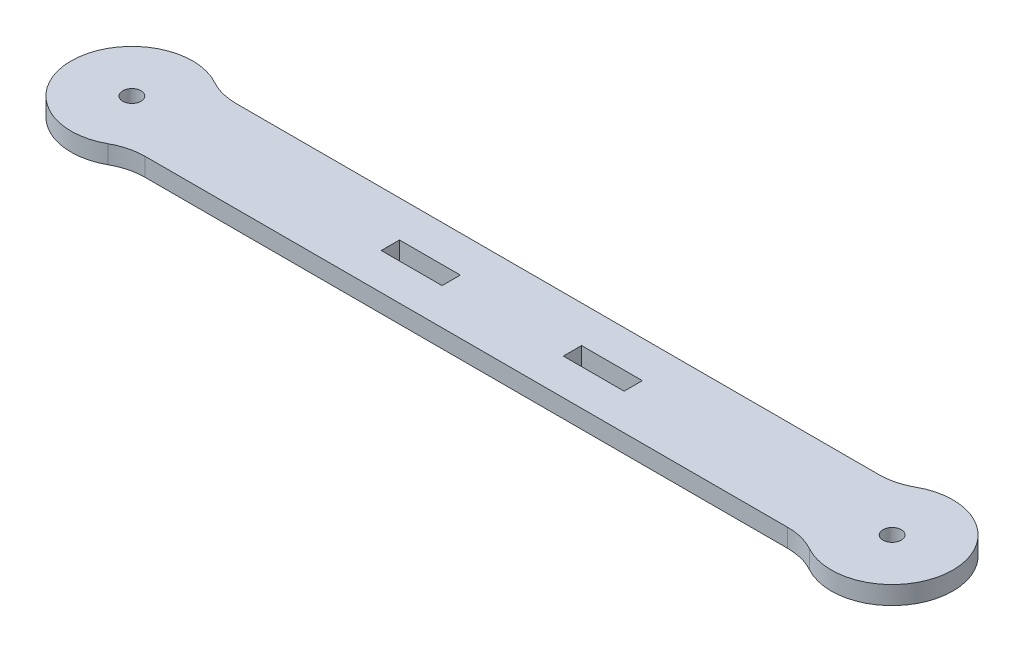
ISO-10303-21;
HEADER;
FILE_DESCRIPTION(('STEP AP214'),'2;1');
FILE_NAME('part.step','',(''),(''),'','','');
FILE_SCHEMA(('AUTOMOTIVE_DESIGN { 1 0 10303 214 1 1 1 1 }'));
ENDSEC;
DATA;
#1=APPLICATION_CONTEXT('core data for automotive mechanical design processes');
#2=APPLICATION_PROTOCOL_DEFINITION('international standard','automotive_design',2000,#1);
#3=PRODUCT_CONTEXT('',#1,'mechanical');
#4=PRODUCT('Part','Part','',(#3));
#5=PRODUCT_RELATED_PRODUCT_CATEGORY('part','',(#4));
#6=PRODUCT_DEFINITION_FORMATION('','',#4);
#7=PRODUCT_DEFINITION_CONTEXT('part definition',#1,'design');
#8=PRODUCT_DEFINITION('design','',#6,#7);
#9=PRODUCT_DEFINITION_SHAPE('','',#8);
#10=(LENGTH_UNIT() NAMED_UNIT(*) SI_UNIT(.MILLI.,.METRE.));
#11=(NAMED_UNIT(*) PLANE_ANGLE_UNIT() SI_UNIT($,.RADIAN.));
#12=(NAMED_UNIT(*) SI_UNIT($,.STERADIAN.) SOLID_ANGLE_UNIT());
#13=UNCERTAINTY_MEASURE_WITH_UNIT(LENGTH_MEASURE(1.E-05),#10,'distance_accuracy_value','');
#14=(GEOMETRIC_REPRESENTATION_CONTEXT(3) GLOBAL_UNCERTAINTY_ASSIGNED_CONTEXT((#13)) GLOBAL_UNIT_ASSIGNED_CONTEXT((#10,
#11,#12)) REPRESENTATION_CONTEXT('',''));
#15=CARTESIAN_POINT('',(0.,0.,0.));
#16=DIRECTION('',(0.,0.,1.));
#17=DIRECTION('',(1.,0.,0.));
#18=AXIS2_PLACEMENT_3D('',#15,#16,#17);
#19=CARTESIAN_POINT('',(-62.5,3.,0.));
#20=DIRECTION('',(0.,1.,0.));
#21=DIRECTION('',(0.,0.,1.));
#22=AXIS2_PLACEMENT_3D('',#19,#20,#21);
#23=PLANE('',#22);
#24=CARTESIAN_POINT('',(-62.5,3.,0.));
#25=DIRECTION('',(0.,1.,0.));
#26=DIRECTION('',(0.,0.,1.));
#27=AXIS2_PLACEMENT_3D('',#24,#25,#26);
#28=CIRCLE('',#27,1.5);
#29=CARTESIAN_POINT('',(-62.5,3.,1.5));
#30=VERTEX_POINT('',#29);
#31=EDGE_CURVE('E259',#30,#30,#28,.T.);
#32=ORIENTED_EDGE('',*,*,#31,.F.);
#33=EDGE_LOOP('',(#32));
#34=FACE_BOUND('',#33,.T.);
#35=DIRECTION('',(-1.,0.,0.));
#36=VECTOR('',#35,1.);
#37=CARTESIAN_POINT('',(-55.8856217223385,3.,-7.5));
#38=LINE('',#37,#36);
#39=CARTESIAN_POINT('',(52.8175416344814,3.,-7.50000000000001));
#40=VERTEX_POINT('',#39);
#41=CARTESIAN_POINT('',(-52.8175416344815,3.,-7.5));
#42=VERTEX_POINT('',#41);
#43=EDGE_CURVE('E279',#40,#42,#38,.T.);
#44=ORIENTED_EDGE('',*,*,#43,.T.);
#45=CARTESIAN_POINT('',(-52.8175416344815,3.,-17.5));
#46=DIRECTION('',(0.,1.,0.));
#47=DIRECTION('',(0.,0.,1.));
#48=AXIS2_PLACEMENT_3D('',#45,#46,#47);
#49=CIRCLE('',#48,10.);
#50=CARTESIAN_POINT('',(-57.6587708172407,3.,-8.75));
#51=VERTEX_POINT('',#50);
#52=EDGE_CURVE('E11',#42,#51,#49,.F.);
#53=ORIENTED_EDGE('',*,*,#52,.T.);
#54=CARTESIAN_POINT('',(-62.5,3.,0.));
#55=DIRECTION('',(0.,1.,0.));
#56=DIRECTION('',(0.,0.,1.));
#57=AXIS2_PLACEMENT_3D('',#54,#55,#56);
#58=CIRCLE('',#57,10.);
#59=CARTESIAN_POINT('',(-57.6587708172407,3.,8.75));
#60=VERTEX_POINT('',#59);
#61=EDGE_CURVE('E267',#51,#60,#58,.T.);
#62=ORIENTED_EDGE('',*,*,#61,.T.);
#63=CARTESIAN_POINT('',(-52.8175416344815,3.,17.5));
#64=DIRECTION('',(0.,1.,0.));
#65=DIRECTION('',(0.,0.,1.));
#66=AXIS2_PLACEMENT_3D('',#63,#64,#65);
#67=CIRCLE('',#66,10.);
#68=CARTESIAN_POINT('',(-52.8175416344815,3.,7.5));
#69=VERTEX_POINT('',#68);
#70=EDGE_CURVE('E331',#60,#69,#67,.F.);
#71=ORIENTED_EDGE('',*,*,#70,.T.);
#72=DIRECTION('',(1.,0.,0.));
#73=VECTOR('',#72,1.);
#74=CARTESIAN_POINT('',(-55.8856217223385,3.,7.5));
#75=LINE('',#74,#73);
#76=CARTESIAN_POINT('',(52.8175416344814,3.,7.49999999999999));
#77=VERTEX_POINT('',#76);
#78=EDGE_CURVE('E271',#69,#77,#75,.T.);
#79=ORIENTED_EDGE('',*,*,#78,.T.);
#80=CARTESIAN_POINT('',(52.8175416344814,3.,17.5));
#81=DIRECTION('',(0.,1.,0.));
#82=DIRECTION('',(0.,0.,1.));
#83=AXIS2_PLACEMENT_3D('',#80,#81,#82);
#84=CIRCLE('',#83,10.);
#85=CARTESIAN_POINT('',(57.6587708172407,3.,8.74999999999998));
#86=VERTEX_POINT('',#85);
#87=EDGE_CURVE('E325',#77,#86,#84,.F.);
#88=ORIENTED_EDGE('',*,*,#87,.T.);
#89=CARTESIAN_POINT('',(62.5,3.,0.));
#90=DIRECTION('',(0.,1.,0.));
#91=DIRECTION('',(0.,0.,1.));
#92=AXIS2_PLACEMENT_3D('',#89,#90,#91);
#93=CIRCLE('',#92,10.);
#94=CARTESIAN_POINT('',(57.6587708172407,3.,-8.75000000000001));
#95=VERTEX_POINT('',#94);
#96=EDGE_CURVE('E276',#86,#95,#93,.T.);
#97=ORIENTED_EDGE('',*,*,#96,.T.);
#98=CARTESIAN_POINT('',(52.8175416344814,3.,-17.5));
#99=DIRECTION('',(0.,1.,0.));
#100=DIRECTION('',(0.,0.,1.));
#101=AXIS2_PLACEMENT_3D('',#98,#99,#100);
#102=CIRCLE('',#101,10.);
#103=EDGE_CURVE('E62',#95,#40,#102,.F.);
#104=ORIENTED_EDGE('',*,*,#103,.T.);
#105=EDGE_LOOP('',(#44,#53,#62,#71,#79,#88,#97,#104));
#106=FACE_BOUND('',#105,.T.);
#107=CARTESIAN_POINT('',(62.5,3.,0.));
#108=DIRECTION('',(0.,1.,0.));
#109=DIRECTION('',(0.,0.,1.));
#110=AXIS2_PLACEMENT_3D('',#107,#108,#109);
#111=CIRCLE('',#110,1.5);
#112=CARTESIAN_POINT('',(62.5,3.,1.49999999999998));
#113=VERTEX_POINT('',#112);
#114=EDGE_CURVE('E251',#113,#113,#111,.T.);
#115=ORIENTED_EDGE('',*,*,#114,.F.);
#116=EDGE_LOOP('',(#115));
#117=FACE_BOUND('',#116,.T.);
#118=DIRECTION('',(1.,0.,0.));
#119=VECTOR('',#118,1.);
#120=CARTESIAN_POINT('',(-20.,3.,1.5));
#121=LINE('',#120,#119);
#122=CARTESIAN_POINT('',(-20.,3.,1.5));
#123=VERTEX_POINT('',#122);
#124=CARTESIAN_POINT('',(-10.,3.,1.50000000000002));
#125=VERTEX_POINT('',#124);
#126=EDGE_CURVE('E211',#123,#125,#121,.T.);
#127=ORIENTED_EDGE('',*,*,#126,.F.);
#128=DIRECTION('',(0.,0.,1.));
#129=VECTOR('',#128,1.);
#130=CARTESIAN_POINT('',(-20.,3.,-1.5));
#131=LINE('',#130,#129);
#132=CARTESIAN_POINT('',(-20.,3.,-1.5));
#133=VERTEX_POINT('',#132);
#134=EDGE_CURVE('E208',#133,#123,#131,.T.);
#135=ORIENTED_EDGE('',*,*,#134,.F.);
#136=DIRECTION('',(-1.,0.,0.));
#137=VECTOR('',#136,1.);
#138=CARTESIAN_POINT('',(-20.,3.,-1.5));
#139=LINE('',#138,#137);
#140=CARTESIAN_POINT('',(-10.,3.,-1.5));
#141=VERTEX_POINT('',#140);
#142=EDGE_CURVE('E219',#141,#133,#139,.T.);
#143=ORIENTED_EDGE('',*,*,#142,.F.);
#144=DIRECTION('',(0.,0.,-1.));
#145=VECTOR('',#144,1.);
#146=CARTESIAN_POINT('',(-10.,3.,-1.5));
#147=LINE('',#146,#145);
#148=EDGE_CURVE('E215',#125,#141,#147,.T.);
#149=ORIENTED_EDGE('',*,*,#148,.F.);
#150=EDGE_LOOP('',(#127,#135,#143,#149));
#151=FACE_BOUND('',#150,.T.);
#152=DIRECTION('',(1.,0.,0.));
#153=VECTOR('',#152,1.);
#154=CARTESIAN_POINT('',(9.99999999999999,3.,1.56405872582707));
#155=LINE('',#154,#153);
#156=CARTESIAN_POINT('',(9.99999999999999,3.,1.56405872582707));
#157=VERTEX_POINT('',#156);
#158=CARTESIAN_POINT('',(20.,3.,1.56405872582707));
#159=VERTEX_POINT('',#158);
#160=EDGE_CURVE('E166',#157,#159,#155,.T.);
#161=ORIENTED_EDGE('',*,*,#160,.F.);
#162=DIRECTION('',(0.,0.,1.));
#163=VECTOR('',#162,1.);
#164=CARTESIAN_POINT('',(10.,3.,-1.43594127417295));
#165=LINE('',#164,#163);
#166=CARTESIAN_POINT('',(10.,3.,-1.43594127417295));
#167=VERTEX_POINT('',#166);
#168=EDGE_CURVE('E155',#167,#157,#165,.T.);
#169=ORIENTED_EDGE('',*,*,#168,.F.);
#170=DIRECTION('',(-1.,0.,0.));
#171=VECTOR('',#170,1.);
#172=CARTESIAN_POINT('',(10.,3.,-1.43594127417295));
#173=LINE('',#172,#171);
#174=CARTESIAN_POINT('',(20.,3.,-1.43594127417295));
#175=VERTEX_POINT('',#174);
#176=EDGE_CURVE('E184',#175,#167,#173,.T.);
#177=ORIENTED_EDGE('',*,*,#176,.F.);
#178=DIRECTION('',(0.,0.,-1.));
#179=VECTOR('',#178,1.);
#180=CARTESIAN_POINT('',(20.,3.,-1.43594127417295));
#181=LINE('',#180,#179);
#182=EDGE_CURVE('E180',#159,#175,#181,.T.);
#183=ORIENTED_EDGE('',*,*,#182,.F.);
#184=EDGE_LOOP('',(#161,#169,#177,#183));
#185=FACE_BOUND('',#184,.T.);
#186=ADVANCED_FACE('F39',(#34,#106,#117,#151,#185),#23,.T.);
#187=CARTESIAN_POINT('',(-62.5,0.,0.));
#188=DIRECTION('',(0.,1.,0.));
#189=DIRECTION('',(0.,0.,1.));
#190=AXIS2_PLACEMENT_3D('',#187,#188,#189);
#191=PLANE('',#190);
#192=DIRECTION('',(0.,0.,1.));
#193=VECTOR('',#192,1.);
#194=CARTESIAN_POINT('',(-20.,0.,-1.5));
#195=LINE('',#194,#193);
#196=CARTESIAN_POINT('',(-20.,0.,-1.5));
#197=VERTEX_POINT('',#196);
#198=CARTESIAN_POINT('',(-20.,0.,1.5));
#199=VERTEX_POINT('',#198);
#200=EDGE_CURVE('E175',#197,#199,#195,.T.);
#201=ORIENTED_EDGE('',*,*,#200,.T.);
#202=DIRECTION('',(1.,0.,0.));
#203=VECTOR('',#202,1.);
#204=CARTESIAN_POINT('',(-20.,0.,1.5));
#205=LINE('',#204,#203);
#206=CARTESIAN_POINT('',(-10.,0.,1.50000000000002));
#207=VERTEX_POINT('',#206);
#208=EDGE_CURVE('E226',#199,#207,#205,.T.);
#209=ORIENTED_EDGE('',*,*,#208,.T.);
#210=DIRECTION('',(0.,0.,-1.));
#211=VECTOR('',#210,1.);
#212=CARTESIAN_POINT('',(-10.,0.,-1.5));
#213=LINE('',#212,#211);
#214=CARTESIAN_POINT('',(-10.,0.,-1.5));
#215=VERTEX_POINT('',#214);
#216=EDGE_CURVE('E230',#207,#215,#213,.T.);
#217=ORIENTED_EDGE('',*,*,#216,.T.);
#218=DIRECTION('',(-1.,0.,0.));
#219=VECTOR('',#218,1.);
#220=CARTESIAN_POINT('',(-20.,0.,-1.5));
#221=LINE('',#220,#219);
#222=EDGE_CURVE('E212',#215,#197,#221,.T.);
#223=ORIENTED_EDGE('',*,*,#222,.T.);
#224=EDGE_LOOP('',(#201,#209,#217,#223));
#225=FACE_BOUND('',#224,.T.);
#226=CARTESIAN_POINT('',(-62.5,0.,0.));
#227=DIRECTION('',(0.,1.,0.));
#228=DIRECTION('',(0.,0.,1.));
#229=AXIS2_PLACEMENT_3D('',#226,#227,#228);
#230=CIRCLE('',#229,10.);
#231=CARTESIAN_POINT('',(-57.6587708172407,0.,-8.75));
#232=VERTEX_POINT('',#231);
#233=CARTESIAN_POINT('',(-57.6587708172407,0.,8.75));
#234=VERTEX_POINT('',#233);
#235=EDGE_CURVE('E263',#232,#234,#230,.T.);
#236=ORIENTED_EDGE('',*,*,#235,.F.);
#237=CARTESIAN_POINT('',(-52.8175416344815,0.,-17.5));
#238=DIRECTION('',(0.,1.,0.));
#239=DIRECTION('',(0.,0.,1.));
#240=AXIS2_PLACEMENT_3D('',#237,#238,#239);
#241=CIRCLE('',#240,10.);
#242=CARTESIAN_POINT('',(-52.8175416344815,0.,-7.5));
#243=VERTEX_POINT('',#242);
#244=EDGE_CURVE('E48',#232,#243,#241,.T.);
#245=ORIENTED_EDGE('',*,*,#244,.T.);
#246=DIRECTION('',(-1.,0.,0.));
#247=VECTOR('',#246,1.);
#248=CARTESIAN_POINT('',(-55.8856217223385,0.,-7.5));
#249=LINE('',#248,#247);
#250=CARTESIAN_POINT('',(52.8175416344814,0.,-7.50000000000001));
#251=VERTEX_POINT('',#250);
#252=EDGE_CURVE('E272',#251,#243,#249,.T.);
#253=ORIENTED_EDGE('',*,*,#252,.F.);
#254=CARTESIAN_POINT('',(52.8175416344814,0.,-17.5));
#255=DIRECTION('',(0.,1.,0.));
#256=DIRECTION('',(0.,0.,1.));
#257=AXIS2_PLACEMENT_3D('',#254,#255,#256);
#258=CIRCLE('',#257,10.);
#259=CARTESIAN_POINT('',(57.6587708172407,0.,-8.75000000000001));
#260=VERTEX_POINT('',#259);
#261=EDGE_CURVE('E334',#251,#260,#258,.T.);
#262=ORIENTED_EDGE('',*,*,#261,.T.);
#263=CARTESIAN_POINT('',(62.5,0.,0.));
#264=DIRECTION('',(0.,1.,0.));
#265=DIRECTION('',(0.,0.,1.));
#266=AXIS2_PLACEMENT_3D('',#263,#264,#265);
#267=CIRCLE('',#266,10.);
#268=CARTESIAN_POINT('',(57.6587708172407,0.,8.74999999999998));
#269=VERTEX_POINT('',#268);
#270=EDGE_CURVE('E290',#269,#260,#267,.T.);
#271=ORIENTED_EDGE('',*,*,#270,.F.);
#272=CARTESIAN_POINT('',(52.8175416344814,0.,17.5));
#273=DIRECTION('',(0.,1.,0.));
#274=DIRECTION('',(0.,0.,1.));
#275=AXIS2_PLACEMENT_3D('',#272,#273,#274);
#276=CIRCLE('',#275,10.);
#277=CARTESIAN_POINT('',(52.8175416344814,0.,7.49999999999999));
#278=VERTEX_POINT('',#277);
#279=EDGE_CURVE('E322',#269,#278,#276,.T.);
#280=ORIENTED_EDGE('',*,*,#279,.T.);
#281=DIRECTION('',(1.,0.,0.));
#282=VECTOR('',#281,1.);
#283=CARTESIAN_POINT('',(-55.8856217223385,0.,7.5));
#284=LINE('',#283,#282);
#285=CARTESIAN_POINT('',(-52.8175416344815,0.,7.5));
#286=VERTEX_POINT('',#285);
#287=EDGE_CURVE('E286',#286,#278,#284,.T.);
#288=ORIENTED_EDGE('',*,*,#287,.F.);
#289=CARTESIAN_POINT('',(-52.8175416344815,0.,17.5));
#290=DIRECTION('',(0.,1.,0.));
#291=DIRECTION('',(0.,0.,1.));
#292=AXIS2_PLACEMENT_3D('',#289,#290,#291);
#293=CIRCLE('',#292,10.);
#294=EDGE_CURVE('E328',#286,#234,#293,.T.);
#295=ORIENTED_EDGE('',*,*,#294,.T.);
#296=EDGE_LOOP('',(#236,#245,#253,#262,#271,#280,#288,#295));
#297=FACE_BOUND('',#296,.T.);
#298=CARTESIAN_POINT('',(-62.5,0.,0.));
#299=DIRECTION('',(0.,1.,0.));
#300=DIRECTION('',(0.,0.,1.));
#301=AXIS2_PLACEMENT_3D('',#298,#299,#300);
#302=CIRCLE('',#301,1.5);
#303=CARTESIAN_POINT('',(-62.5,0.,1.5));
#304=VERTEX_POINT('',#303);
#305=EDGE_CURVE('E255',#304,#304,#302,.T.);
#306=ORIENTED_EDGE('',*,*,#305,.T.);
#307=EDGE_LOOP('',(#306));
#308=FACE_BOUND('',#307,.T.);
#309=CARTESIAN_POINT('',(62.5,0.,0.));
#310=DIRECTION('',(0.,1.,0.));
#311=DIRECTION('',(0.,0.,1.));
#312=AXIS2_PLACEMENT_3D('',#309,#310,#311);
#313=CIRCLE('',#312,1.5);
#314=CARTESIAN_POINT('',(62.5,0.,1.49999999999998));
#315=VERTEX_POINT('',#314);
#316=EDGE_CURVE('E250',#315,#315,#313,.T.);
#317=ORIENTED_EDGE('',*,*,#316,.T.);
#318=EDGE_LOOP('',(#317));
#319=FACE_BOUND('',#318,.T.);
#320=DIRECTION('',(0.,0.,1.));
#321=VECTOR('',#320,1.);
#322=CARTESIAN_POINT('',(10.,0.,-1.43594127417295));
#323=LINE('',#322,#321);
#324=CARTESIAN_POINT('',(9.99999999999999,0.,-1.43594127417295));
#325=VERTEX_POINT('',#324);
#326=CARTESIAN_POINT('',(9.99999999999999,0.,1.56405872582707));
#327=VERTEX_POINT('',#326);
#328=EDGE_CURVE('E189',#325,#327,#323,.T.);
#329=ORIENTED_EDGE('',*,*,#328,.T.);
#330=DIRECTION('',(1.,0.,0.));
#331=VECTOR('',#330,1.);
#332=CARTESIAN_POINT('',(9.99999999999999,0.,1.56405872582707));
#333=LINE('',#332,#331);
#334=CARTESIAN_POINT('',(20.,0.,1.56405872582707));
#335=VERTEX_POINT('',#334);
#336=EDGE_CURVE('E173',#327,#335,#333,.T.);
#337=ORIENTED_EDGE('',*,*,#336,.T.);
#338=DIRECTION('',(0.,0.,-1.));
#339=VECTOR('',#338,1.);
#340=CARTESIAN_POINT('',(20.,0.,-1.43594127417295));
#341=LINE('',#340,#339);
#342=CARTESIAN_POINT('',(20.,0.,-1.43594127417295));
#343=VERTEX_POINT('',#342);
#344=EDGE_CURVE('E194',#335,#343,#341,.T.);
#345=ORIENTED_EDGE('',*,*,#344,.T.);
#346=DIRECTION('',(-1.,0.,0.));
#347=VECTOR('',#346,1.);
#348=CARTESIAN_POINT('',(10.,0.,-1.43594127417295));
#349=LINE('',#348,#347);
#350=EDGE_CURVE('E167',#343,#325,#349,.T.);
#351=ORIENTED_EDGE('',*,*,#350,.T.);
#352=EDGE_LOOP('',(#329,#337,#345,#351));
#353=FACE_BOUND('',#352,.T.);
#354=ADVANCED_FACE('F342',(#225,#297,#308,#319,#353),#191,.F.);
#355=CARTESIAN_POINT('',(-62.5,3.,0.));
#356=DIRECTION('',(0.,-1.,0.));
#357=DIRECTION('',(0.,0.,-1.));
#358=AXIS2_PLACEMENT_3D('',#355,#356,#357);
#359=CYLINDRICAL_SURFACE('',#358,10.);
#360=ORIENTED_EDGE('',*,*,#235,.T.);
#361=DIRECTION('',(0.,-1.,0.));
#362=VECTOR('',#361,1.);
#363=CARTESIAN_POINT('',(-57.6587708172407,3.,8.75));
#364=LINE('',#363,#362);
#365=EDGE_CURVE('E313',#234,#60,#364,.F.);
#366=ORIENTED_EDGE('',*,*,#365,.T.);
#367=ORIENTED_EDGE('',*,*,#61,.F.);
#368=DIRECTION('',(0.,-1.,0.));
#369=VECTOR('',#368,1.);
#370=CARTESIAN_POINT('',(-57.6587708172407,3.,-8.75));
#371=LINE('',#370,#369);
#372=EDGE_CURVE('E309',#51,#232,#371,.T.);
#373=ORIENTED_EDGE('',*,*,#372,.T.);
#374=EDGE_LOOP('',(#360,#366,#367,#373));
#375=FACE_BOUND('',#374,.T.);
#376=ADVANCED_FACE('F353',(#375),#359,.T.);
#377=CARTESIAN_POINT('',(-55.8856217223385,3.,7.5));
#378=DIRECTION('',(0.,0.,-1.));
#379=DIRECTION('',(-1.,0.,0.));
#380=AXIS2_PLACEMENT_3D('',#377,#378,#379);
#381=PLANE('',#380);
#382=ORIENTED_EDGE('',*,*,#287,.T.);
#383=DIRECTION('',(0.,1.,0.));
#384=VECTOR('',#383,1.);
#385=CARTESIAN_POINT('',(52.8175416344814,3.,7.49999999999999));
#386=LINE('',#385,#384);
#387=EDGE_CURVE('E306',#278,#77,#386,.T.);
#388=ORIENTED_EDGE('',*,*,#387,.T.);
#389=ORIENTED_EDGE('',*,*,#78,.F.);
#390=DIRECTION('',(0.,1.,0.));
#391=VECTOR('',#390,1.);
#392=CARTESIAN_POINT('',(-52.8175416344815,0.,7.5));
#393=LINE('',#392,#391);
#394=EDGE_CURVE('E302',#69,#286,#393,.F.);
#395=ORIENTED_EDGE('',*,*,#394,.T.);
#396=EDGE_LOOP('',(#382,#388,#389,#395));
#397=FACE_BOUND('',#396,.T.);
#398=ADVANCED_FACE('F361',(#397),#381,.F.);
#399=CARTESIAN_POINT('',(62.5,3.,0.));
#400=DIRECTION('',(0.,-1.,0.));
#401=DIRECTION('',(0.,0.,-1.));
#402=AXIS2_PLACEMENT_3D('',#399,#400,#401);
#403=CYLINDRICAL_SURFACE('',#402,10.);
#404=ORIENTED_EDGE('',*,*,#96,.F.);
#405=DIRECTION('',(0.,-1.,0.));
#406=VECTOR('',#405,1.);
#407=CARTESIAN_POINT('',(57.6587708172407,3.,8.74999999999999));
#408=LINE('',#407,#406);
#409=EDGE_CURVE('E298',#86,#269,#408,.T.);
#410=ORIENTED_EDGE('',*,*,#409,.T.);
#411=ORIENTED_EDGE('',*,*,#270,.T.);
#412=DIRECTION('',(0.,-1.,0.));
#413=VECTOR('',#412,1.);
#414=CARTESIAN_POINT('',(57.6587708172407,3.,-8.75000000000002));
#415=LINE('',#414,#413);
#416=EDGE_CURVE('E282',#260,#95,#415,.F.);
#417=ORIENTED_EDGE('',*,*,#416,.T.);
#418=EDGE_LOOP('',(#404,#410,#411,#417));
#419=FACE_BOUND('',#418,.T.);
#420=ADVANCED_FACE('F369',(#419),#403,.T.);
#421=CARTESIAN_POINT('',(-55.8856217223385,3.,-7.5));
#422=DIRECTION('',(0.,0.,1.));
#423=DIRECTION('',(1.,0.,0.));
#424=AXIS2_PLACEMENT_3D('',#421,#422,#423);
#425=PLANE('',#424);
#426=ORIENTED_EDGE('',*,*,#43,.F.);
#427=DIRECTION('',(0.,1.,0.));
#428=VECTOR('',#427,1.);
#429=CARTESIAN_POINT('',(52.8175416344814,0.,-7.50000000000001));
#430=LINE('',#429,#428);
#431=EDGE_CURVE('E318',#40,#251,#430,.F.);
#432=ORIENTED_EDGE('',*,*,#431,.T.);
#433=ORIENTED_EDGE('',*,*,#252,.T.);
#434=DIRECTION('',(0.,1.,0.));
#435=VECTOR('',#434,1.);
#436=CARTESIAN_POINT('',(-52.8175416344815,3.,-7.5));
#437=LINE('',#436,#435);
#438=EDGE_CURVE('E55',#243,#42,#437,.T.);
#439=ORIENTED_EDGE('',*,*,#438,.T.);
#440=EDGE_LOOP('',(#426,#432,#433,#439));
#441=FACE_BOUND('',#440,.T.);
#442=ADVANCED_FACE('F346',(#441),#425,.F.);
#443=CARTESIAN_POINT('',(-62.5,3.,0.));
#444=DIRECTION('',(0.,-1.,0.));
#445=DIRECTION('',(0.,0.,-1.));
#446=AXIS2_PLACEMENT_3D('',#443,#444,#445);
#447=CYLINDRICAL_SURFACE('',#446,1.5);
#448=ORIENTED_EDGE('',*,*,#31,.T.);
#449=EDGE_LOOP('',(#448));
#450=FACE_BOUND('',#449,.T.);
#451=ORIENTED_EDGE('',*,*,#305,.F.);
#452=EDGE_LOOP('',(#451));
#453=FACE_BOUND('',#452,.T.);
#454=ADVANCED_FACE('F390',(#450,#453),#447,.F.);
#455=CARTESIAN_POINT('',(62.5,3.,0.));
#456=DIRECTION('',(0.,-1.,0.));
#457=DIRECTION('',(0.,0.,-1.));
#458=AXIS2_PLACEMENT_3D('',#455,#456,#457);
#459=CYLINDRICAL_SURFACE('',#458,1.5);
#460=ORIENTED_EDGE('',*,*,#114,.T.);
#461=EDGE_LOOP('',(#460));
#462=FACE_BOUND('',#461,.T.);
#463=ORIENTED_EDGE('',*,*,#316,.F.);
#464=EDGE_LOOP('',(#463));
#465=FACE_BOUND('',#464,.T.);
#466=ADVANCED_FACE('F434',(#462,#465),#459,.F.);
#467=CARTESIAN_POINT('',(-20.,3.,-1.5));
#468=DIRECTION('',(1.,0.,0.));
#469=DIRECTION('',(0.,0.,-1.));
#470=AXIS2_PLACEMENT_3D('',#467,#468,#469);
#471=PLANE('',#470);
#472=ORIENTED_EDGE('',*,*,#200,.F.);
#473=DIRECTION('',(0.,-1.,0.));
#474=VECTOR('',#473,1.);
#475=CARTESIAN_POINT('',(-20.,3.,-1.5));
#476=LINE('',#475,#474);
#477=EDGE_CURVE('E222',#133,#197,#476,.T.);
#478=ORIENTED_EDGE('',*,*,#477,.F.);
#479=ORIENTED_EDGE('',*,*,#134,.T.);
#480=DIRECTION('',(0.,-1.,0.));
#481=VECTOR('',#480,1.);
#482=CARTESIAN_POINT('',(-20.,3.,1.5));
#483=LINE('',#482,#481);
#484=EDGE_CURVE('E246',#123,#199,#483,.T.);
#485=ORIENTED_EDGE('',*,*,#484,.T.);
#486=EDGE_LOOP('',(#472,#478,#479,#485));
#487=FACE_BOUND('',#486,.T.);
#488=ADVANCED_FACE('F431',(#487),#471,.T.);
#489=CARTESIAN_POINT('',(-20.,3.,1.5));
#490=DIRECTION('',(0.,0.,-1.));
#491=DIRECTION('',(-1.,0.,0.));
#492=AXIS2_PLACEMENT_3D('',#489,#490,#491);
#493=PLANE('',#492);
#494=ORIENTED_EDGE('',*,*,#208,.F.);
#495=ORIENTED_EDGE('',*,*,#484,.F.);
#496=ORIENTED_EDGE('',*,*,#126,.T.);
#497=DIRECTION('',(0.,-1.,0.));
#498=VECTOR('',#497,1.);
#499=CARTESIAN_POINT('',(-10.,3.,1.50000000000002));
#500=LINE('',#499,#498);
#501=EDGE_CURVE('E243',#125,#207,#500,.T.);
#502=ORIENTED_EDGE('',*,*,#501,.T.);
#503=EDGE_LOOP('',(#494,#495,#496,#502));
#504=FACE_BOUND('',#503,.T.);
#505=ADVANCED_FACE('F427',(#504),#493,.T.);
#506=CARTESIAN_POINT('',(-10.,3.,-1.5));
#507=DIRECTION('',(-1.,0.,0.));
#508=DIRECTION('',(0.,0.,1.));
#509=AXIS2_PLACEMENT_3D('',#506,#507,#508);
#510=PLANE('',#509);
#511=ORIENTED_EDGE('',*,*,#216,.F.);
#512=ORIENTED_EDGE('',*,*,#501,.F.);
#513=ORIENTED_EDGE('',*,*,#148,.T.);
#514=DIRECTION('',(0.,-1.,0.));
#515=VECTOR('',#514,1.);
#516=CARTESIAN_POINT('',(-10.,3.,-1.5));
#517=LINE('',#516,#515);
#518=EDGE_CURVE('E240',#141,#215,#517,.T.);
#519=ORIENTED_EDGE('',*,*,#518,.T.);
#520=EDGE_LOOP('',(#511,#512,#513,#519));
#521=FACE_BOUND('',#520,.T.);
#522=ADVANCED_FACE('F423',(#521),#510,.T.);
#523=CARTESIAN_POINT('',(-20.,3.,-1.5));
#524=DIRECTION('',(0.,0.,1.));
#525=DIRECTION('',(1.,0.,0.));
#526=AXIS2_PLACEMENT_3D('',#523,#524,#525);
#527=PLANE('',#526);
#528=ORIENTED_EDGE('',*,*,#222,.F.);
#529=ORIENTED_EDGE('',*,*,#518,.F.);
#530=ORIENTED_EDGE('',*,*,#142,.T.);
#531=ORIENTED_EDGE('',*,*,#477,.T.);
#532=EDGE_LOOP('',(#528,#529,#530,#531));
#533=FACE_BOUND('',#532,.T.);
#534=ADVANCED_FACE('F420',(#533),#527,.T.);
#535=CARTESIAN_POINT('',(10.,3.,-1.43594127417295));
#536=DIRECTION('',(1.,0.,0.));
#537=DIRECTION('',(0.,0.,-1.));
#538=AXIS2_PLACEMENT_3D('',#535,#536,#537);
#539=PLANE('',#538);
#540=ORIENTED_EDGE('',*,*,#328,.F.);
#541=DIRECTION('',(0.,-1.,0.));
#542=VECTOR('',#541,1.);
#543=CARTESIAN_POINT('',(10.,3.,-1.43594127417295));
#544=LINE('',#543,#542);
#545=EDGE_CURVE('E161',#167,#325,#544,.T.);
#546=ORIENTED_EDGE('',*,*,#545,.F.);
#547=ORIENTED_EDGE('',*,*,#168,.T.);
#548=DIRECTION('',(0.,-1.,0.));
#549=VECTOR('',#548,1.);
#550=CARTESIAN_POINT('',(9.99999999999999,3.,1.56405872582707));
#551=LINE('',#550,#549);
#552=EDGE_CURVE('E158',#157,#327,#551,.T.);
#553=ORIENTED_EDGE('',*,*,#552,.T.);
#554=EDGE_LOOP('',(#540,#546,#547,#553));
#555=FACE_BOUND('',#554,.T.);
#556=ADVANCED_FACE('F157',(#555),#539,.T.);
#557=CARTESIAN_POINT('',(9.99999999999999,3.,1.56405872582707));
#558=DIRECTION('',(0.,0.,-1.));
#559=DIRECTION('',(-1.,0.,0.));
#560=AXIS2_PLACEMENT_3D('',#557,#558,#559);
#561=PLANE('',#560);
#562=ORIENTED_EDGE('',*,*,#336,.F.);
#563=ORIENTED_EDGE('',*,*,#552,.F.);
#564=ORIENTED_EDGE('',*,*,#160,.T.);
#565=DIRECTION('',(0.,-1.,0.));
#566=VECTOR('',#565,1.);
#567=CARTESIAN_POINT('',(20.,3.,1.56405872582707));
#568=LINE('',#567,#566);
#569=EDGE_CURVE('E176',#159,#335,#568,.T.);
#570=ORIENTED_EDGE('',*,*,#569,.T.);
#571=EDGE_LOOP('',(#562,#563,#564,#570));
#572=FACE_BOUND('',#571,.T.);
#573=ADVANCED_FACE('F170',(#572),#561,.T.);
#574=CARTESIAN_POINT('',(20.,3.,-1.43594127417295));
#575=DIRECTION('',(-1.,0.,0.));
#576=DIRECTION('',(0.,0.,1.));
#577=AXIS2_PLACEMENT_3D('',#574,#575,#576);
#578=PLANE('',#577);
#579=ORIENTED_EDGE('',*,*,#344,.F.);
#580=ORIENTED_EDGE('',*,*,#569,.F.);
#581=ORIENTED_EDGE('',*,*,#182,.T.);
#582=DIRECTION('',(0.,-1.,0.));
#583=VECTOR('',#582,1.);
#584=CARTESIAN_POINT('',(20.,3.,-1.43594127417295));
#585=LINE('',#584,#583);
#586=EDGE_CURVE('E203',#175,#343,#585,.T.);
#587=ORIENTED_EDGE('',*,*,#586,.T.);
#588=EDGE_LOOP('',(#579,#580,#581,#587));
#589=FACE_BOUND('',#588,.T.);
#590=ADVANCED_FACE('F406',(#589),#578,.T.);
#591=CARTESIAN_POINT('',(10.,3.,-1.43594127417295));
#592=DIRECTION('',(0.,0.,1.));
#593=DIRECTION('',(1.,0.,0.));
#594=AXIS2_PLACEMENT_3D('',#591,#592,#593);
#595=PLANE('',#594);
#596=ORIENTED_EDGE('',*,*,#350,.F.);
#597=ORIENTED_EDGE('',*,*,#586,.F.);
#598=ORIENTED_EDGE('',*,*,#176,.T.);
#599=ORIENTED_EDGE('',*,*,#545,.T.);
#600=EDGE_LOOP('',(#596,#597,#598,#599));
#601=FACE_BOUND('',#600,.T.);
#602=ADVANCED_FACE('F402',(#601),#595,.T.);
#603=CARTESIAN_POINT('',(52.8175416344814,3.,17.5));
#604=DIRECTION('',(0.,-1.,0.));
#605=DIRECTION('',(0.,0.,-1.));
#606=AXIS2_PLACEMENT_3D('',#603,#604,#605);
#607=CYLINDRICAL_SURFACE('',#606,10.);
#608=ORIENTED_EDGE('',*,*,#87,.F.);
#609=ORIENTED_EDGE('',*,*,#387,.F.);
#610=ORIENTED_EDGE('',*,*,#279,.F.);
#611=ORIENTED_EDGE('',*,*,#409,.F.);
#612=EDGE_LOOP('',(#608,#609,#610,#611));
#613=FACE_BOUND('',#612,.T.);
#614=ADVANCED_FACE('F365',(#613),#607,.F.);
#615=CARTESIAN_POINT('',(-52.8175416344815,3.,17.5));
#616=DIRECTION('',(0.,-1.,0.));
#617=DIRECTION('',(0.,0.,-1.));
#618=AXIS2_PLACEMENT_3D('',#615,#616,#617);
#619=CYLINDRICAL_SURFACE('',#618,10.);
#620=ORIENTED_EDGE('',*,*,#70,.F.);
#621=ORIENTED_EDGE('',*,*,#365,.F.);
#622=ORIENTED_EDGE('',*,*,#294,.F.);
#623=ORIENTED_EDGE('',*,*,#394,.F.);
#624=EDGE_LOOP('',(#620,#621,#622,#623));
#625=FACE_BOUND('',#624,.T.);
#626=ADVANCED_FACE('F356',(#625),#619,.F.);
#627=CARTESIAN_POINT('',(52.8175416344814,3.,-17.5));
#628=DIRECTION('',(0.,-1.,0.));
#629=DIRECTION('',(0.,0.,-1.));
#630=AXIS2_PLACEMENT_3D('',#627,#628,#629);
#631=CYLINDRICAL_SURFACE('',#630,10.);
#632=ORIENTED_EDGE('',*,*,#103,.F.);
#633=ORIENTED_EDGE('',*,*,#416,.F.);
#634=ORIENTED_EDGE('',*,*,#261,.F.);
#635=ORIENTED_EDGE('',*,*,#431,.F.);
#636=EDGE_LOOP('',(#632,#633,#634,#635));
#637=FACE_BOUND('',#636,.T.);
#638=ADVANCED_FACE('F373',(#637),#631,.F.);
#639=CARTESIAN_POINT('',(-52.8175416344815,3.,-17.5));
#640=DIRECTION('',(0.,-1.,0.));
#641=DIRECTION('',(0.,0.,-1.));
#642=AXIS2_PLACEMENT_3D('',#639,#640,#641);
#643=CYLINDRICAL_SURFACE('',#642,10.);
#644=ORIENTED_EDGE('',*,*,#52,.F.);
#645=ORIENTED_EDGE('',*,*,#438,.F.);
#646=ORIENTED_EDGE('',*,*,#244,.F.);
#647=ORIENTED_EDGE('',*,*,#372,.F.);
#648=EDGE_LOOP('',(#644,#645,#646,#647));
#649=FACE_BOUND('',#648,.T.);
#650=ADVANCED_FACE('F41',(#649),#643,.F.);
#651=CLOSED_SHELL('',(#186,#354,#376,#398,#420,#442,#454,#466,#488,#505,#522,#534,#556,#573,
#590,#602,#614,#626,#638,#650));
#652=MANIFOLD_SOLID_BREP('B2',#651);
#653=ADVANCED_BREP_SHAPE_REPRESENTATION('',(#18,#652),#14);
#654=SHAPE_DEFINITION_REPRESENTATION(#9,#653);
ENDSEC;
END-ISO-10303-21;
